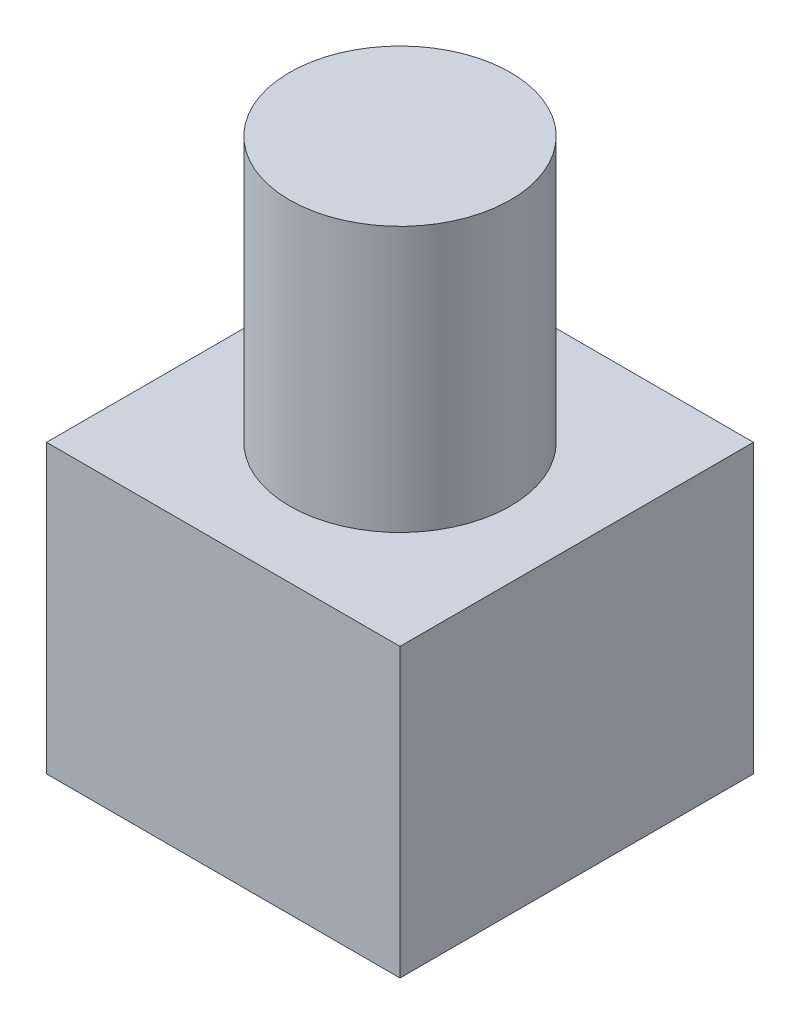
ISO-10303-21;
HEADER;
FILE_DESCRIPTION(('STEP AP214'),'2;1');
FILE_NAME('part.step','',(''),(''),'','','');
FILE_SCHEMA(('AUTOMOTIVE_DESIGN { 1 0 10303 214 1 1 1 1 }'));
ENDSEC;
DATA;
#1=APPLICATION_CONTEXT('core data for automotive mechanical design processes');
#2=APPLICATION_PROTOCOL_DEFINITION('international standard','automotive_design',2000,#1);
#3=PRODUCT_CONTEXT('',#1,'mechanical');
#4=PRODUCT('Part','Part','',(#3));
#5=PRODUCT_RELATED_PRODUCT_CATEGORY('part','',(#4));
#6=PRODUCT_DEFINITION_FORMATION('','',#4);
#7=PRODUCT_DEFINITION_CONTEXT('part definition',#1,'design');
#8=PRODUCT_DEFINITION('design','',#6,#7);
#9=PRODUCT_DEFINITION_SHAPE('','',#8);
#10=(LENGTH_UNIT() NAMED_UNIT(*) SI_UNIT(.MILLI.,.METRE.));
#11=(NAMED_UNIT(*) PLANE_ANGLE_UNIT() SI_UNIT($,.RADIAN.));
#12=(NAMED_UNIT(*) SI_UNIT($,.STERADIAN.) SOLID_ANGLE_UNIT());
#13=UNCERTAINTY_MEASURE_WITH_UNIT(LENGTH_MEASURE(1.E-05),#10,'distance_accuracy_value','');
#14=(GEOMETRIC_REPRESENTATION_CONTEXT(3) GLOBAL_UNCERTAINTY_ASSIGNED_CONTEXT((#13)) GLOBAL_UNIT_ASSIGNED_CONTEXT((#10,
#11,#12)) REPRESENTATION_CONTEXT('',''));
#15=CARTESIAN_POINT('',(0.,0.,0.));
#16=DIRECTION('',(0.,0.,1.));
#17=DIRECTION('',(1.,0.,0.));
#18=AXIS2_PLACEMENT_3D('',#15,#16,#17);
#19=CARTESIAN_POINT('',(4.,6.5,4.));
#20=DIRECTION('',(-1.,0.,0.));
#21=DIRECTION('',(0.,0.,1.));
#22=AXIS2_PLACEMENT_3D('',#19,#20,#21);
#23=PLANE('',#22);
#24=DIRECTION('',(0.,0.,-1.));
#25=VECTOR('',#24,1.);
#26=CARTESIAN_POINT('',(4.,0.,4.));
#27=LINE('',#26,#25);
#28=CARTESIAN_POINT('',(4.,0.,4.));
#29=VERTEX_POINT('',#28);
#30=CARTESIAN_POINT('',(4.,0.,-4.));
#31=VERTEX_POINT('',#30);
#32=EDGE_CURVE('E116',#29,#31,#27,.T.);
#33=ORIENTED_EDGE('',*,*,#32,.T.);
#34=DIRECTION('',(0.,-1.,0.));
#35=VECTOR('',#34,1.);
#36=CARTESIAN_POINT('',(4.,6.5,-4.));
#37=LINE('',#36,#35);
#38=CARTESIAN_POINT('',(4.,6.5,-4.));
#39=VERTEX_POINT('',#38);
#40=EDGE_CURVE('E48',#39,#31,#37,.T.);
#41=ORIENTED_EDGE('',*,*,#40,.F.);
#42=DIRECTION('',(0.,0.,-1.));
#43=VECTOR('',#42,1.);
#44=CARTESIAN_POINT('',(4.,6.5,4.));
#45=LINE('',#44,#43);
#46=CARTESIAN_POINT('',(4.,6.5,4.));
#47=VERTEX_POINT('',#46);
#48=EDGE_CURVE('E99',#47,#39,#45,.T.);
#49=ORIENTED_EDGE('',*,*,#48,.F.);
#50=DIRECTION('',(0.,-1.,0.));
#51=VECTOR('',#50,1.);
#52=CARTESIAN_POINT('',(4.,6.5,4.));
#53=LINE('',#52,#51);
#54=EDGE_CURVE('E112',#47,#29,#53,.T.);
#55=ORIENTED_EDGE('',*,*,#54,.T.);
#56=EDGE_LOOP('',(#33,#41,#49,#55));
#57=FACE_BOUND('',#56,.T.);
#58=ADVANCED_FACE('F45',(#57),#23,.F.);
#59=CARTESIAN_POINT('',(-4.,6.5,-4.));
#60=DIRECTION('',(0.,0.,1.));
#61=DIRECTION('',(1.,0.,0.));
#62=AXIS2_PLACEMENT_3D('',#59,#60,#61);
#63=PLANE('',#62);
#64=DIRECTION('',(-1.,0.,0.));
#65=VECTOR('',#64,1.);
#66=CARTESIAN_POINT('',(-4.,0.,-4.));
#67=LINE('',#66,#65);
#68=CARTESIAN_POINT('',(-4.,0.,-4.));
#69=VERTEX_POINT('',#68);
#70=EDGE_CURVE('E105',#31,#69,#67,.T.);
#71=ORIENTED_EDGE('',*,*,#70,.T.);
#72=DIRECTION('',(0.,-1.,0.));
#73=VECTOR('',#72,1.);
#74=CARTESIAN_POINT('',(-4.,6.5,-4.));
#75=LINE('',#74,#73);
#76=CARTESIAN_POINT('',(-4.,6.5,-4.));
#77=VERTEX_POINT('',#76);
#78=EDGE_CURVE('E103',#77,#69,#75,.T.);
#79=ORIENTED_EDGE('',*,*,#78,.F.);
#80=DIRECTION('',(-1.,0.,0.));
#81=VECTOR('',#80,1.);
#82=CARTESIAN_POINT('',(-4.,6.5,-4.));
#83=LINE('',#82,#81);
#84=EDGE_CURVE('E94',#39,#77,#83,.T.);
#85=ORIENTED_EDGE('',*,*,#84,.F.);
#86=ORIENTED_EDGE('',*,*,#40,.T.);
#87=EDGE_LOOP('',(#71,#79,#85,#86));
#88=FACE_BOUND('',#87,.T.);
#89=ADVANCED_FACE('F104',(#88),#63,.F.);
#90=CARTESIAN_POINT('',(-4.,6.5,4.));
#91=DIRECTION('',(1.,0.,0.));
#92=DIRECTION('',(0.,0.,-1.));
#93=AXIS2_PLACEMENT_3D('',#90,#91,#92);
#94=PLANE('',#93);
#95=DIRECTION('',(0.,0.,1.));
#96=VECTOR('',#95,1.);
#97=CARTESIAN_POINT('',(-4.,0.,4.));
#98=LINE('',#97,#96);
#99=CARTESIAN_POINT('',(-4.,0.,4.));
#100=VERTEX_POINT('',#99);
#101=EDGE_CURVE('E80',#69,#100,#98,.T.);
#102=ORIENTED_EDGE('',*,*,#101,.T.);
#103=DIRECTION('',(0.,-1.,0.));
#104=VECTOR('',#103,1.);
#105=CARTESIAN_POINT('',(-4.,6.5,4.));
#106=LINE('',#105,#104);
#107=CARTESIAN_POINT('',(-4.,6.5,4.));
#108=VERTEX_POINT('',#107);
#109=EDGE_CURVE('E107',#108,#100,#106,.T.);
#110=ORIENTED_EDGE('',*,*,#109,.F.);
#111=DIRECTION('',(0.,0.,1.));
#112=VECTOR('',#111,1.);
#113=CARTESIAN_POINT('',(-4.,6.5,4.));
#114=LINE('',#113,#112);
#115=EDGE_CURVE('E97',#77,#108,#114,.T.);
#116=ORIENTED_EDGE('',*,*,#115,.F.);
#117=ORIENTED_EDGE('',*,*,#78,.T.);
#118=EDGE_LOOP('',(#102,#110,#116,#117));
#119=FACE_BOUND('',#118,.T.);
#120=ADVANCED_FACE('F108',(#119),#94,.F.);
#121=CARTESIAN_POINT('',(-4.,6.5,4.));
#122=DIRECTION('',(0.,0.,-1.));
#123=DIRECTION('',(-1.,0.,0.));
#124=AXIS2_PLACEMENT_3D('',#121,#122,#123);
#125=PLANE('',#124);
#126=DIRECTION('',(1.,0.,0.));
#127=VECTOR('',#126,1.);
#128=CARTESIAN_POINT('',(-4.,0.,4.));
#129=LINE('',#128,#127);
#130=EDGE_CURVE('E86',#100,#29,#129,.T.);
#131=ORIENTED_EDGE('',*,*,#130,.T.);
#132=ORIENTED_EDGE('',*,*,#54,.F.);
#133=DIRECTION('',(1.,0.,0.));
#134=VECTOR('',#133,1.);
#135=CARTESIAN_POINT('',(-4.,6.5,4.));
#136=LINE('',#135,#134);
#137=EDGE_CURVE('E63',#108,#47,#136,.T.);
#138=ORIENTED_EDGE('',*,*,#137,.F.);
#139=ORIENTED_EDGE('',*,*,#109,.T.);
#140=EDGE_LOOP('',(#131,#132,#138,#139));
#141=FACE_BOUND('',#140,.T.);
#142=ADVANCED_FACE('F130',(#141),#125,.F.);
#143=CARTESIAN_POINT('',(0.,6.5,0.));
#144=DIRECTION('',(0.,-1.,0.));
#145=DIRECTION('',(0.,0.,-1.));
#146=AXIS2_PLACEMENT_3D('',#143,#144,#145);
#147=PLANE('',#146);
#148=CARTESIAN_POINT('',(0.,6.5,0.));
#149=DIRECTION('',(0.,1.,0.));
#150=DIRECTION('',(0.,0.,1.));
#151=AXIS2_PLACEMENT_3D('',#148,#149,#150);
#152=CIRCLE('',#151,2.5);
#153=CARTESIAN_POINT('',(0.,6.5,2.5));
#154=VERTEX_POINT('',#153);
#155=EDGE_CURVE('E11',#154,#154,#152,.T.);
#156=ORIENTED_EDGE('',*,*,#155,.F.);
#157=EDGE_LOOP('',(#156));
#158=FACE_BOUND('',#157,.T.);
#159=ORIENTED_EDGE('',*,*,#48,.T.);
#160=ORIENTED_EDGE('',*,*,#84,.T.);
#161=ORIENTED_EDGE('',*,*,#115,.T.);
#162=ORIENTED_EDGE('',*,*,#137,.T.);
#163=EDGE_LOOP('',(#159,#160,#161,#162));
#164=FACE_BOUND('',#163,.T.);
#165=ADVANCED_FACE('F95',(#158,#164),#147,.F.);
#166=CARTESIAN_POINT('',(0.,0.,0.));
#167=DIRECTION('',(0.,-1.,0.));
#168=DIRECTION('',(0.,0.,-1.));
#169=AXIS2_PLACEMENT_3D('',#166,#167,#168);
#170=PLANE('',#169);
#171=ORIENTED_EDGE('',*,*,#32,.F.);
#172=ORIENTED_EDGE('',*,*,#130,.F.);
#173=ORIENTED_EDGE('',*,*,#101,.F.);
#174=ORIENTED_EDGE('',*,*,#70,.F.);
#175=EDGE_LOOP('',(#171,#172,#173,#174));
#176=FACE_BOUND('',#175,.T.);
#177=ADVANCED_FACE('F133',(#176),#170,.T.);
#178=CARTESIAN_POINT('',(0.,12.5,0.));
#179=DIRECTION('',(0.,-1.,0.));
#180=DIRECTION('',(0.,0.,-1.));
#181=AXIS2_PLACEMENT_3D('',#178,#179,#180);
#182=CYLINDRICAL_SURFACE('',#181,2.5);
#183=CARTESIAN_POINT('',(0.,12.5,0.));
#184=DIRECTION('',(0.,1.,0.));
#185=DIRECTION('',(0.,0.,1.));
#186=AXIS2_PLACEMENT_3D('',#183,#184,#185);
#187=CIRCLE('',#186,2.5);
#188=CARTESIAN_POINT('',(0.,12.5,2.5));
#189=VERTEX_POINT('',#188);
#190=EDGE_CURVE('E120',#189,#189,#187,.T.);
#191=ORIENTED_EDGE('',*,*,#190,.F.);
#192=EDGE_LOOP('',(#191));
#193=FACE_BOUND('',#192,.T.);
#194=ORIENTED_EDGE('',*,*,#155,.T.);
#195=EDGE_LOOP('',(#194));
#196=FACE_BOUND('',#195,.T.);
#197=ADVANCED_FACE('F143',(#193,#196),#182,.T.);
#198=CARTESIAN_POINT('',(0.,12.5,0.));
#199=DIRECTION('',(0.,1.,0.));
#200=DIRECTION('',(0.,0.,1.));
#201=AXIS2_PLACEMENT_3D('',#198,#199,#200);
#202=PLANE('',#201);
#203=ORIENTED_EDGE('',*,*,#190,.T.);
#204=EDGE_LOOP('',(#203));
#205=FACE_BOUND('',#204,.T.);
#206=ADVANCED_FACE('F141',(#205),#202,.T.);
#207=CLOSED_SHELL('',(#58,#89,#120,#142,#165,#177,#197,#206));
#208=MANIFOLD_SOLID_BREP('B2',#207);
#209=ADVANCED_BREP_SHAPE_REPRESENTATION('',(#18,#208),#14);
#210=SHAPE_DEFINITION_REPRESENTATION(#9,#209);
ENDSEC;
END-ISO-10303-21;
